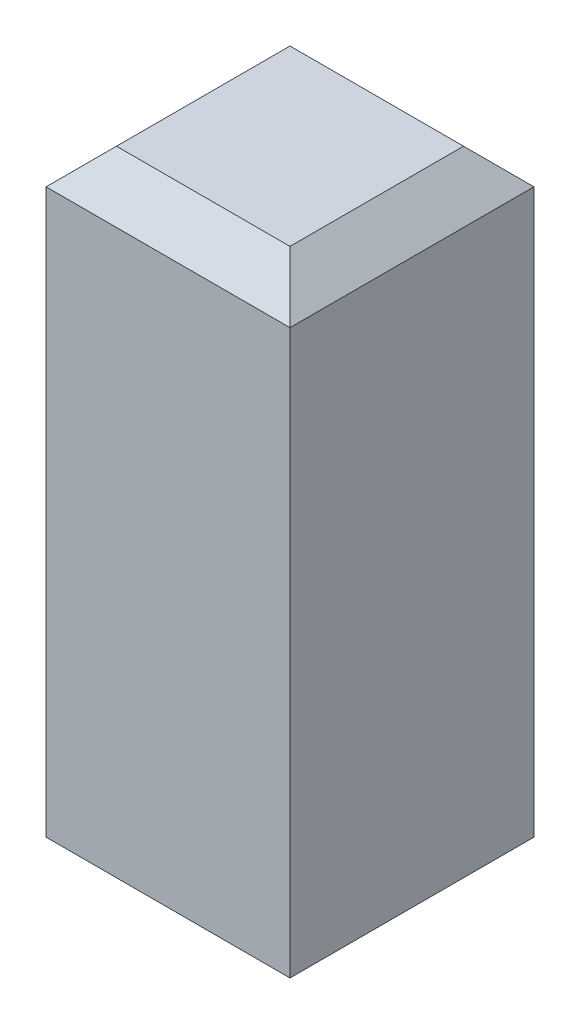
ISO-10303-21;
HEADER;
FILE_DESCRIPTION(('STEP AP214'),'2;1');
FILE_NAME('part.step','',(''),(''),'','','');
FILE_SCHEMA(('AUTOMOTIVE_DESIGN { 1 0 10303 214 1 1 1 1 }'));
ENDSEC;
DATA;
#1=APPLICATION_CONTEXT('core data for automotive mechanical design processes');
#2=APPLICATION_PROTOCOL_DEFINITION('international standard','automotive_design',2000,#1);
#3=PRODUCT_CONTEXT('',#1,'mechanical');
#4=PRODUCT('Part','Part','',(#3));
#5=PRODUCT_RELATED_PRODUCT_CATEGORY('part','',(#4));
#6=PRODUCT_DEFINITION_FORMATION('','',#4);
#7=PRODUCT_DEFINITION_CONTEXT('part definition',#1,'design');
#8=PRODUCT_DEFINITION('design','',#6,#7);
#9=PRODUCT_DEFINITION_SHAPE('','',#8);
#10=(LENGTH_UNIT() NAMED_UNIT(*) SI_UNIT(.MILLI.,.METRE.));
#11=(NAMED_UNIT(*) PLANE_ANGLE_UNIT() SI_UNIT($,.RADIAN.));
#12=(NAMED_UNIT(*) SI_UNIT($,.STERADIAN.) SOLID_ANGLE_UNIT());
#13=UNCERTAINTY_MEASURE_WITH_UNIT(LENGTH_MEASURE(1.E-05),#10,'distance_accuracy_value','');
#14=(GEOMETRIC_REPRESENTATION_CONTEXT(3) GLOBAL_UNCERTAINTY_ASSIGNED_CONTEXT((#13)) GLOBAL_UNIT_ASSIGNED_CONTEXT((#10,
#11,#12)) REPRESENTATION_CONTEXT('',''));
#15=CARTESIAN_POINT('',(0.,0.,0.));
#16=DIRECTION('',(0.,0.,1.));
#17=DIRECTION('',(1.,0.,0.));
#18=AXIS2_PLACEMENT_3D('',#15,#16,#17);
#19=CARTESIAN_POINT('',(0.,11.43,0.));
#20=DIRECTION('',(1.,0.,0.));
#21=DIRECTION('',(0.,0.,-1.));
#22=AXIS2_PLACEMENT_3D('',#19,#20,#21);
#23=PLANE('',#22);
#24=DIRECTION('',(0.,-1.,0.));
#25=VECTOR('',#24,1.);
#26=CARTESIAN_POINT('',(0.,11.43,-4.40032549932388));
#27=LINE('',#26,#25);
#28=CARTESIAN_POINT('',(0.,10.795,-4.40032549932388));
#29=VERTEX_POINT('',#28);
#30=CARTESIAN_POINT('',(0.,0.635,-4.40032549932388));
#31=VERTEX_POINT('',#30);
#32=EDGE_CURVE('E167',#29,#31,#27,.T.);
#33=ORIENTED_EDGE('',*,*,#32,.T.);
#34=DIRECTION('',(0.,0.,1.));
#35=VECTOR('',#34,1.);
#36=CARTESIAN_POINT('',(0.,0.635,0.));
#37=LINE('',#36,#35);
#38=CARTESIAN_POINT('',(0.,0.635,0.));
#39=VERTEX_POINT('',#38);
#40=EDGE_CURVE('E181',#31,#39,#37,.T.);
#41=ORIENTED_EDGE('',*,*,#40,.T.);
#42=DIRECTION('',(0.,-1.,0.));
#43=VECTOR('',#42,1.);
#44=CARTESIAN_POINT('',(0.,11.43,0.));
#45=LINE('',#44,#43);
#46=CARTESIAN_POINT('',(0.,10.795,0.));
#47=VERTEX_POINT('',#46);
#48=EDGE_CURVE('E138',#47,#39,#45,.T.);
#49=ORIENTED_EDGE('',*,*,#48,.F.);
#50=DIRECTION('',(0.,0.,-1.));
#51=VECTOR('',#50,1.);
#52=CARTESIAN_POINT('',(0.,10.795,0.));
#53=LINE('',#52,#51);
#54=EDGE_CURVE('E184',#47,#29,#53,.T.);
#55=ORIENTED_EDGE('',*,*,#54,.T.);
#56=EDGE_LOOP('',(#33,#41,#49,#55));
#57=FACE_BOUND('',#56,.T.);
#58=ADVANCED_FACE('F47',(#57),#23,.F.);
#59=CARTESIAN_POINT('',(0.,11.43,0.));
#60=DIRECTION('',(0.,0.,-1.));
#61=DIRECTION('',(-1.,0.,0.));
#62=AXIS2_PLACEMENT_3D('',#59,#60,#61);
#63=PLANE('',#62);
#64=ORIENTED_EDGE('',*,*,#48,.T.);
#65=DIRECTION('',(1.,0.,0.));
#66=VECTOR('',#65,1.);
#67=CARTESIAN_POINT('',(4.40032549932388,0.635,0.));
#68=LINE('',#67,#66);
#69=CARTESIAN_POINT('',(4.40032549932388,0.635,0.));
#70=VERTEX_POINT('',#69);
#71=EDGE_CURVE('E136',#39,#70,#68,.T.);
#72=ORIENTED_EDGE('',*,*,#71,.T.);
#73=DIRECTION('',(0.,-1.,0.));
#74=VECTOR('',#73,1.);
#75=CARTESIAN_POINT('',(4.40032549932388,11.43,0.));
#76=LINE('',#75,#74);
#77=CARTESIAN_POINT('',(4.40032549932388,10.795,0.));
#78=VERTEX_POINT('',#77);
#79=EDGE_CURVE('E118',#78,#70,#76,.T.);
#80=ORIENTED_EDGE('',*,*,#79,.F.);
#81=DIRECTION('',(-1.,0.,0.));
#82=VECTOR('',#81,1.);
#83=CARTESIAN_POINT('',(0.,10.795,0.));
#84=LINE('',#83,#82);
#85=EDGE_CURVE('E133',#78,#47,#84,.T.);
#86=ORIENTED_EDGE('',*,*,#85,.T.);
#87=EDGE_LOOP('',(#64,#72,#80,#86));
#88=FACE_BOUND('',#87,.T.);
#89=ADVANCED_FACE('F132',(#88),#63,.F.);
#90=CARTESIAN_POINT('',(4.40032549932388,11.43,0.));
#91=DIRECTION('',(-1.,0.,0.));
#92=DIRECTION('',(0.,0.,1.));
#93=AXIS2_PLACEMENT_3D('',#90,#91,#92);
#94=PLANE('',#93);
#95=ORIENTED_EDGE('',*,*,#79,.T.);
#96=DIRECTION('',(0.,0.,-1.));
#97=VECTOR('',#96,1.);
#98=CARTESIAN_POINT('',(4.40032549932388,0.635,-4.40032549932388));
#99=LINE('',#98,#97);
#100=CARTESIAN_POINT('',(4.40032549932388,0.635,-4.40032549932388));
#101=VERTEX_POINT('',#100);
#102=EDGE_CURVE('E125',#70,#101,#99,.T.);
#103=ORIENTED_EDGE('',*,*,#102,.T.);
#104=DIRECTION('',(0.,-1.,0.));
#105=VECTOR('',#104,1.);
#106=CARTESIAN_POINT('',(4.40032549932388,11.43,-4.40032549932388));
#107=LINE('',#106,#105);
#108=CARTESIAN_POINT('',(4.40032549932388,10.795,-4.40032549932388));
#109=VERTEX_POINT('',#108);
#110=EDGE_CURVE('E120',#109,#101,#107,.T.);
#111=ORIENTED_EDGE('',*,*,#110,.F.);
#112=DIRECTION('',(0.,0.,1.));
#113=VECTOR('',#112,1.);
#114=CARTESIAN_POINT('',(4.40032549932388,10.795,0.));
#115=LINE('',#114,#113);
#116=EDGE_CURVE('E115',#109,#78,#115,.T.);
#117=ORIENTED_EDGE('',*,*,#116,.T.);
#118=EDGE_LOOP('',(#95,#103,#111,#117));
#119=FACE_BOUND('',#118,.T.);
#120=ADVANCED_FACE('F117',(#119),#94,.F.);
#121=CARTESIAN_POINT('',(0.,11.43,-4.40032549932388));
#122=DIRECTION('',(0.,0.,1.));
#123=DIRECTION('',(1.,0.,0.));
#124=AXIS2_PLACEMENT_3D('',#121,#122,#123);
#125=PLANE('',#124);
#126=ORIENTED_EDGE('',*,*,#110,.T.);
#127=DIRECTION('',(-1.,0.,0.));
#128=VECTOR('',#127,1.);
#129=CARTESIAN_POINT('',(0.,0.635,-4.40032549932388));
#130=LINE('',#129,#128);
#131=EDGE_CURVE('E187',#101,#31,#130,.T.);
#132=ORIENTED_EDGE('',*,*,#131,.T.);
#133=ORIENTED_EDGE('',*,*,#32,.F.);
#134=DIRECTION('',(1.,0.,0.));
#135=VECTOR('',#134,1.);
#136=CARTESIAN_POINT('',(0.,10.795,-4.40032549932388));
#137=LINE('',#136,#135);
#138=EDGE_CURVE('E190',#29,#109,#137,.T.);
#139=ORIENTED_EDGE('',*,*,#138,.T.);
#140=EDGE_LOOP('',(#126,#132,#133,#139));
#141=FACE_BOUND('',#140,.T.);
#142=ADVANCED_FACE('F238',(#141),#125,.F.);
#143=CARTESIAN_POINT('',(0.,11.43,0.));
#144=DIRECTION('',(0.,-1.,0.));
#145=DIRECTION('',(0.,0.,-1.));
#146=AXIS2_PLACEMENT_3D('',#143,#144,#145);
#147=PLANE('',#146);
#148=DIRECTION('',(0.,0.,-1.));
#149=VECTOR('',#148,1.);
#150=CARTESIAN_POINT('',(3.76532549932388,11.43,0.));
#151=LINE('',#150,#149);
#152=CARTESIAN_POINT('',(3.76532549932388,11.43,-0.635));
#153=VERTEX_POINT('',#152);
#154=CARTESIAN_POINT('',(3.76532549932388,11.43,-3.76532549932388));
#155=VERTEX_POINT('',#154);
#156=EDGE_CURVE('E58',#153,#155,#151,.T.);
#157=ORIENTED_EDGE('',*,*,#156,.T.);
#158=DIRECTION('',(-1.,0.,0.));
#159=VECTOR('',#158,1.);
#160=CARTESIAN_POINT('',(0.,11.43,-3.76532549932388));
#161=LINE('',#160,#159);
#162=CARTESIAN_POINT('',(0.635,11.43,-3.76532549932388));
#163=VERTEX_POINT('',#162);
#164=EDGE_CURVE('E11',#155,#163,#161,.T.);
#165=ORIENTED_EDGE('',*,*,#164,.T.);
#166=DIRECTION('',(0.,0.,1.));
#167=VECTOR('',#166,1.);
#168=CARTESIAN_POINT('',(0.635,11.43,0.));
#169=LINE('',#168,#167);
#170=CARTESIAN_POINT('',(0.635,11.43,-0.635));
#171=VERTEX_POINT('',#170);
#172=EDGE_CURVE('E178',#163,#171,#169,.T.);
#173=ORIENTED_EDGE('',*,*,#172,.T.);
#174=DIRECTION('',(1.,0.,0.));
#175=VECTOR('',#174,1.);
#176=CARTESIAN_POINT('',(0.,11.43,-0.635));
#177=LINE('',#176,#175);
#178=EDGE_CURVE('E69',#171,#153,#177,.T.);
#179=ORIENTED_EDGE('',*,*,#178,.T.);
#180=EDGE_LOOP('',(#157,#165,#173,#179));
#181=FACE_BOUND('',#180,.T.);
#182=ADVANCED_FACE('F244',(#181),#147,.F.);
#183=CARTESIAN_POINT('',(0.,0.,0.));
#184=DIRECTION('',(0.,-1.,0.));
#185=DIRECTION('',(0.,0.,-1.));
#186=AXIS2_PLACEMENT_3D('',#183,#184,#185);
#187=PLANE('',#186);
#188=DIRECTION('',(0.,0.,1.));
#189=VECTOR('',#188,1.);
#190=CARTESIAN_POINT('',(3.76532549932388,0.,0.));
#191=LINE('',#190,#189);
#192=CARTESIAN_POINT('',(3.76532549932388,0.,-3.76532549932388));
#193=VERTEX_POINT('',#192);
#194=CARTESIAN_POINT('',(3.76532549932388,0.,-0.635000000000002));
#195=VERTEX_POINT('',#194);
#196=EDGE_CURVE('E198',#193,#195,#191,.T.);
#197=ORIENTED_EDGE('',*,*,#196,.T.);
#198=DIRECTION('',(-1.,0.,0.));
#199=VECTOR('',#198,1.);
#200=CARTESIAN_POINT('',(0.,0.,-0.635000000000002));
#201=LINE('',#200,#199);
#202=CARTESIAN_POINT('',(0.635000000000002,0.,-0.635000000000002));
#203=VERTEX_POINT('',#202);
#204=EDGE_CURVE('E126',#195,#203,#201,.T.);
#205=ORIENTED_EDGE('',*,*,#204,.T.);
#206=DIRECTION('',(0.,0.,-1.));
#207=VECTOR('',#206,1.);
#208=CARTESIAN_POINT('',(0.635000000000002,0.,-4.40032549932388));
#209=LINE('',#208,#207);
#210=CARTESIAN_POINT('',(0.635000000000002,0.,-3.76532549932388));
#211=VERTEX_POINT('',#210);
#212=EDGE_CURVE('E204',#203,#211,#209,.T.);
#213=ORIENTED_EDGE('',*,*,#212,.T.);
#214=DIRECTION('',(1.,0.,0.));
#215=VECTOR('',#214,1.);
#216=CARTESIAN_POINT('',(4.40032549932388,0.,-3.76532549932388));
#217=LINE('',#216,#215);
#218=EDGE_CURVE('E201',#211,#193,#217,.T.);
#219=ORIENTED_EDGE('',*,*,#218,.T.);
#220=EDGE_LOOP('',(#197,#205,#213,#219));
#221=FACE_BOUND('',#220,.T.);
#222=ADVANCED_FACE('F246',(#221),#187,.T.);
#223=CARTESIAN_POINT('',(0.,0.635,-4.40032549932388));
#224=DIRECTION('',(0.,-0.707106781186548,-0.707106781186547));
#225=DIRECTION('',(1.,0.,0.));
#226=AXIS2_PLACEMENT_3D('',#223,#224,#225);
#227=PLANE('',#226);
#228=DIRECTION('',(-0.577350269189626,-0.577350269189625,0.577350269189626));
#229=VECTOR('',#228,1.);
#230=CARTESIAN_POINT('',(2.93355033288259,-0.831775166441294,-2.93355033288259));
#231=LINE('',#230,#229);
#232=EDGE_CURVE('E168',#193,#101,#231,.F.);
#233=ORIENTED_EDGE('',*,*,#232,.F.);
#234=ORIENTED_EDGE('',*,*,#218,.F.);
#235=DIRECTION('',(0.577350269189626,-0.577350269189625,0.577350269189626));
#236=VECTOR('',#235,1.);
#237=CARTESIAN_POINT('',(1.4667751664413,-0.831775166441294,-2.93355033288259));
#238=LINE('',#237,#236);
#239=EDGE_CURVE('E163',#31,#211,#238,.T.);
#240=ORIENTED_EDGE('',*,*,#239,.F.);
#241=ORIENTED_EDGE('',*,*,#131,.F.);
#242=EDGE_LOOP('',(#233,#234,#240,#241));
#243=FACE_BOUND('',#242,.T.);
#244=ADVANCED_FACE('F225',(#243),#227,.T.);
#245=CARTESIAN_POINT('',(0.,0.635,0.));
#246=DIRECTION('',(-0.707106781186547,-0.707106781186548,0.));
#247=DIRECTION('',(0.,0.,-1.));
#248=AXIS2_PLACEMENT_3D('',#245,#246,#247);
#249=PLANE('',#248);
#250=ORIENTED_EDGE('',*,*,#239,.T.);
#251=ORIENTED_EDGE('',*,*,#212,.F.);
#252=DIRECTION('',(-0.577350269189626,0.577350269189625,0.577350269189626));
#253=VECTOR('',#252,1.);
#254=CARTESIAN_POINT('',(0.,0.635,0.));
#255=LINE('',#254,#253);
#256=EDGE_CURVE('E152',#39,#203,#255,.F.);
#257=ORIENTED_EDGE('',*,*,#256,.F.);
#258=ORIENTED_EDGE('',*,*,#40,.F.);
#259=EDGE_LOOP('',(#250,#251,#257,#258));
#260=FACE_BOUND('',#259,.T.);
#261=ADVANCED_FACE('F229',(#260),#249,.T.);
#262=CARTESIAN_POINT('',(4.40032549932388,0.635,0.));
#263=DIRECTION('',(0.707106781186547,-0.707106781186548,0.));
#264=DIRECTION('',(0.,0.,1.));
#265=AXIS2_PLACEMENT_3D('',#262,#263,#264);
#266=PLANE('',#265);
#267=ORIENTED_EDGE('',*,*,#232,.T.);
#268=ORIENTED_EDGE('',*,*,#102,.F.);
#269=DIRECTION('',(-0.577350269189626,-0.577350269189625,-0.577350269189626));
#270=VECTOR('',#269,1.);
#271=CARTESIAN_POINT('',(4.40032549932388,0.635,0.));
#272=LINE('',#271,#270);
#273=EDGE_CURVE('E149',#195,#70,#272,.F.);
#274=ORIENTED_EDGE('',*,*,#273,.F.);
#275=ORIENTED_EDGE('',*,*,#196,.F.);
#276=EDGE_LOOP('',(#267,#268,#274,#275));
#277=FACE_BOUND('',#276,.T.);
#278=ADVANCED_FACE('F237',(#277),#266,.T.);
#279=CARTESIAN_POINT('',(0.,0.635,0.));
#280=DIRECTION('',(0.,-0.707106781186548,0.707106781186547));
#281=DIRECTION('',(-1.,0.,0.));
#282=AXIS2_PLACEMENT_3D('',#279,#280,#281);
#283=PLANE('',#282);
#284=ORIENTED_EDGE('',*,*,#256,.T.);
#285=ORIENTED_EDGE('',*,*,#204,.F.);
#286=ORIENTED_EDGE('',*,*,#273,.T.);
#287=ORIENTED_EDGE('',*,*,#71,.F.);
#288=EDGE_LOOP('',(#284,#285,#286,#287));
#289=FACE_BOUND('',#288,.T.);
#290=ADVANCED_FACE('F232',(#289),#283,.T.);
#291=CARTESIAN_POINT('',(0.,11.43,-0.635));
#292=DIRECTION('',(0.,-0.707106781186547,-0.707106781186548));
#293=DIRECTION('',(1.,0.,0.));
#294=AXIS2_PLACEMENT_3D('',#291,#292,#293);
#295=PLANE('',#294);
#296=DIRECTION('',(0.577350269189625,0.577350269189627,-0.577350269189625));
#297=VECTOR('',#296,1.);
#298=CARTESIAN_POINT('',(0.423333333333334,11.2183333333333,-0.423333333333334));
#299=LINE('',#298,#297);
#300=EDGE_CURVE('E143',#47,#171,#299,.T.);
#301=ORIENTED_EDGE('',*,*,#300,.F.);
#302=ORIENTED_EDGE('',*,*,#85,.F.);
#303=DIRECTION('',(-0.577350269189625,0.577350269189627,-0.577350269189625));
#304=VECTOR('',#303,1.);
#305=CARTESIAN_POINT('',(2.51021699954926,12.6851084997746,-1.89010849977463));
#306=LINE('',#305,#304);
#307=EDGE_CURVE('E52',#153,#78,#306,.F.);
#308=ORIENTED_EDGE('',*,*,#307,.F.);
#309=ORIENTED_EDGE('',*,*,#178,.F.);
#310=EDGE_LOOP('',(#301,#302,#308,#309));
#311=FACE_BOUND('',#310,.T.);
#312=ADVANCED_FACE('F50',(#311),#295,.F.);
#313=CARTESIAN_POINT('',(3.76532549932388,11.43,0.));
#314=DIRECTION('',(-0.707106781186548,-0.707106781186547,0.));
#315=DIRECTION('',(0.,0.,-1.));
#316=AXIS2_PLACEMENT_3D('',#313,#314,#315);
#317=PLANE('',#316);
#318=ORIENTED_EDGE('',*,*,#307,.T.);
#319=ORIENTED_EDGE('',*,*,#116,.F.);
#320=DIRECTION('',(-0.577350269189625,0.577350269189627,0.577350269189625));
#321=VECTOR('',#320,1.);
#322=CARTESIAN_POINT('',(2.51021699954926,12.6851084997746,-2.51021699954926));
#323=LINE('',#322,#321);
#324=EDGE_CURVE('E154',#155,#109,#323,.F.);
#325=ORIENTED_EDGE('',*,*,#324,.F.);
#326=ORIENTED_EDGE('',*,*,#156,.F.);
#327=EDGE_LOOP('',(#318,#319,#325,#326));
#328=FACE_BOUND('',#327,.T.);
#329=ADVANCED_FACE('F147',(#328),#317,.F.);
#330=CARTESIAN_POINT('',(0.635,11.43,0.));
#331=DIRECTION('',(0.707106781186548,-0.707106781186547,0.));
#332=DIRECTION('',(0.,0.,1.));
#333=AXIS2_PLACEMENT_3D('',#330,#331,#332);
#334=PLANE('',#333);
#335=ORIENTED_EDGE('',*,*,#300,.T.);
#336=ORIENTED_EDGE('',*,*,#172,.F.);
#337=DIRECTION('',(-0.577350269189625,-0.577350269189627,-0.577350269189625));
#338=VECTOR('',#337,1.);
#339=CARTESIAN_POINT('',(1.89010849977463,12.6851084997746,-2.51021699954926));
#340=LINE('',#339,#338);
#341=EDGE_CURVE('E158',#29,#163,#340,.F.);
#342=ORIENTED_EDGE('',*,*,#341,.F.);
#343=ORIENTED_EDGE('',*,*,#54,.F.);
#344=EDGE_LOOP('',(#335,#336,#342,#343));
#345=FACE_BOUND('',#344,.T.);
#346=ADVANCED_FACE('F243',(#345),#334,.F.);
#347=CARTESIAN_POINT('',(0.,11.43,-3.76532549932388));
#348=DIRECTION('',(0.,-0.707106781186547,0.707106781186548));
#349=DIRECTION('',(-1.,0.,0.));
#350=AXIS2_PLACEMENT_3D('',#347,#348,#349);
#351=PLANE('',#350);
#352=ORIENTED_EDGE('',*,*,#324,.T.);
#353=ORIENTED_EDGE('',*,*,#138,.F.);
#354=ORIENTED_EDGE('',*,*,#341,.T.);
#355=ORIENTED_EDGE('',*,*,#164,.F.);
#356=EDGE_LOOP('',(#352,#353,#354,#355));
#357=FACE_BOUND('',#356,.T.);
#358=ADVANCED_FACE('F241',(#357),#351,.F.);
#359=CLOSED_SHELL('',(#58,#89,#120,#142,#182,#222,#244,#261,#278,#290,#312,#329,#346,#358));
#360=MANIFOLD_SOLID_BREP('B2',#359);
#361=ADVANCED_BREP_SHAPE_REPRESENTATION('',(#18,#360),#14);
#362=SHAPE_DEFINITION_REPRESENTATION(#9,#361);
ENDSEC;
END-ISO-10303-21;
